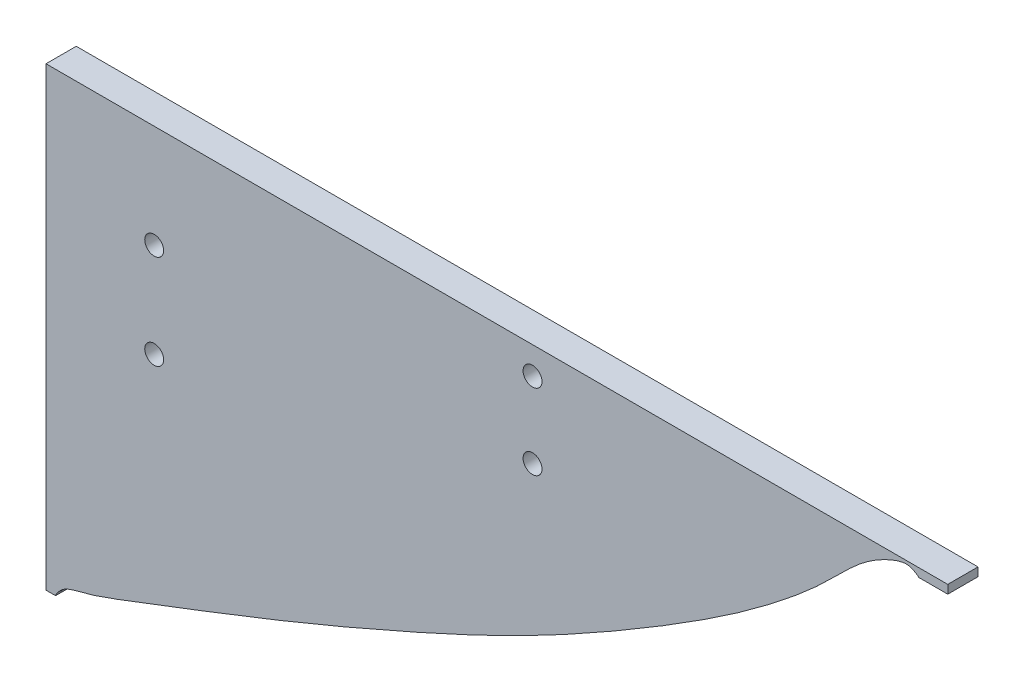
ISO-10303-21;
HEADER;
FILE_DESCRIPTION(('STEP AP214'),'2;1');
FILE_NAME('part.step','',(''),(''),'','','');
FILE_SCHEMA(('AUTOMOTIVE_DESIGN { 1 0 10303 214 1 1 1 1 }'));
ENDSEC;
DATA;
#1=APPLICATION_CONTEXT('core data for automotive mechanical design processes');
#2=APPLICATION_PROTOCOL_DEFINITION('international standard','automotive_design',2000,#1);
#3=PRODUCT_CONTEXT('',#1,'mechanical');
#4=PRODUCT('Part','Part','',(#3));
#5=PRODUCT_RELATED_PRODUCT_CATEGORY('part','',(#4));
#6=PRODUCT_DEFINITION_FORMATION('','',#4);
#7=PRODUCT_DEFINITION_CONTEXT('part definition',#1,'design');
#8=PRODUCT_DEFINITION('design','',#6,#7);
#9=PRODUCT_DEFINITION_SHAPE('','',#8);
#10=(LENGTH_UNIT() NAMED_UNIT(*) SI_UNIT(.MILLI.,.METRE.));
#11=(NAMED_UNIT(*) PLANE_ANGLE_UNIT() SI_UNIT($,.RADIAN.));
#12=(NAMED_UNIT(*) SI_UNIT($,.STERADIAN.) SOLID_ANGLE_UNIT());
#13=UNCERTAINTY_MEASURE_WITH_UNIT(LENGTH_MEASURE(1.E-05),#10,'distance_accuracy_value','');
#14=(GEOMETRIC_REPRESENTATION_CONTEXT(3) GLOBAL_UNCERTAINTY_ASSIGNED_CONTEXT((#13)) GLOBAL_UNIT_ASSIGNED_CONTEXT((#10,
#11,#12)) REPRESENTATION_CONTEXT('',''));
#15=CARTESIAN_POINT('',(0.,0.,0.));
#16=DIRECTION('',(0.,0.,1.));
#17=DIRECTION('',(1.,0.,0.));
#18=AXIS2_PLACEMENT_3D('',#15,#16,#17);
#19=CARTESIAN_POINT('',(-6.38847800720886,-67.6544227135779,132.));
#20=DIRECTION('',(0.,0.,-1.));
#21=DIRECTION('',(-1.,0.,0.));
#22=AXIS2_PLACEMENT_3D('',#19,#20,#21);
#23=PLANE('',#22);
#24=CARTESIAN_POINT('',(-100.,-50.,132.));
#25=DIRECTION('',(0.,0.,-1.));
#26=DIRECTION('',(-1.,0.,0.));
#27=AXIS2_PLACEMENT_3D('',#24,#25,#26);
#28=CIRCLE('',#27,2.5);
#29=CARTESIAN_POINT('',(-102.5,-50.,132.));
#30=VERTEX_POINT('',#29);
#31=EDGE_CURVE('E182',#30,#30,#28,.F.);
#32=ORIENTED_EDGE('',*,*,#31,.F.);
#33=EDGE_LOOP('',(#32));
#34=FACE_BOUND('',#33,.T.);
#35=CARTESIAN_POINT('',(0.0705666698621599,-4.96037406111782,132.));
#36=DIRECTION('',(0.,0.,-1.));
#37=DIRECTION('',(-1.,0.,0.));
#38=AXIS2_PLACEMENT_3D('',#35,#36,#37);
#39=CIRCLE('',#38,2.5);
#40=CARTESIAN_POINT('',(-2.42943333013784,-4.96037406111782,132.));
#41=VERTEX_POINT('',#40);
#42=EDGE_CURVE('E178',#41,#41,#39,.F.);
#43=ORIENTED_EDGE('',*,*,#42,.F.);
#44=EDGE_LOOP('',(#43));
#45=FACE_BOUND('',#44,.T.);
#46=CARTESIAN_POINT('',(102.255883432908,0.,132.));
#47=CARTESIAN_POINT('',(102.212333702175,0.0757853467575065,132.));
#48=CARTESIAN_POINT('',(102.15674500759,0.143644147111157,132.));
#49=CARTESIAN_POINT('',(102.031689039428,0.261850328451282,132.));
#50=CARTESIAN_POINT('',(101.961396337404,0.313864031923214,132.));
#51=CARTESIAN_POINT('',(101.743153899466,0.456916701566914,132.));
#52=CARTESIAN_POINT('',(101.590113741541,0.538561158667253,132.));
#53=CARTESIAN_POINT('',(101.285515903748,0.704546557379673,132.));
#54=CARTESIAN_POINT('',(101.135038893224,0.790853132229553,132.));
#55=CARTESIAN_POINT('',(100.830369958525,0.956709212530448,132.));
#56=CARTESIAN_POINT('',(100.675386799418,1.03511937173944,132.));
#57=CARTESIAN_POINT('',(100.358269386812,1.17769336420937,132.));
#58=CARTESIAN_POINT('',(100.197786977393,1.24188972080921,132.));
#59=CARTESIAN_POINT('',(99.8694857009078,1.34324074708624,132.));
#60=CARTESIAN_POINT('',(99.7013817997487,1.37934480036868,132.));
#61=CARTESIAN_POINT('',(99.358171575679,1.42574245374584,132.));
#62=CARTESIAN_POINT('',(99.1828585913646,1.43584947354909,132.));
#63=CARTESIAN_POINT('',(98.8372618622271,1.43510779384474,132.));
#64=CARTESIAN_POINT('',(98.6654304424398,1.42454375565803,132.));
#65=CARTESIAN_POINT('',(98.1519730994347,1.37137917150377,132.));
#66=CARTESIAN_POINT('',(97.8113579053392,1.30759815360346,132.));
#67=CARTESIAN_POINT('',(97.137425552706,1.15053661480719,132.));
#68=CARTESIAN_POINT('',(96.8059108548438,1.05870475531274,132.));
#69=CARTESIAN_POINT('',(95.8256317795282,0.748403885964516,132.));
#70=CARTESIAN_POINT('',(95.1909751337491,0.495513349615646,132.));
#71=CARTESIAN_POINT('',(93.9391842818814,-0.0530208130887405,132.));
#72=CARTESIAN_POINT('',(93.322654058673,-0.350138100355449,132.));
#73=CARTESIAN_POINT('',(92.1063389223837,-0.985229642510167,132.));
#74=CARTESIAN_POINT('',(91.5062710275768,-1.322691455428,132.));
#75=CARTESIAN_POINT('',(89.7488909647868,-2.3779604982981,132.));
#76=CARTESIAN_POINT('',(88.6284065608409,-3.14434191539668,132.));
#77=CARTESIAN_POINT('',(85.4169513530649,-5.62802153888396,132.));
#78=CARTESIAN_POINT('',(83.4639636842948,-7.51507379862691,132.));
#79=CARTESIAN_POINT('',(80.56562165714,-10.3839615966199,132.));
#80=CARTESIAN_POINT('',(79.6035536826595,-11.3452023134844,132.));
#81=CARTESIAN_POINT('',(77.6597820281172,-13.2439593645554,132.));
#82=CARTESIAN_POINT('',(76.6801903849135,-14.184049900242,132.));
#83=CARTESIAN_POINT('',(73.6999171590888,-16.9543026958801,132.));
#84=CARTESIAN_POINT('',(71.6553559072728,-18.7315758230486,132.));
#85=CARTESIAN_POINT('',(67.4892024660388,-22.1932749898395,132.));
#86=CARTESIAN_POINT('',(65.3681058831868,-23.8782983949837,132.));
#87=CARTESIAN_POINT('',(61.0697266750759,-27.1806229295135,132.));
#88=CARTESIAN_POINT('',(58.8915498559034,-28.7968462672591,132.));
#89=CARTESIAN_POINT('',(54.4766885782321,-31.958772395036,132.));
#90=CARTESIAN_POINT('',(52.2416055237548,-33.5047717594547,132.));
#91=CARTESIAN_POINT('',(47.7353420637075,-36.5373977922789,132.));
#92=CARTESIAN_POINT('',(45.463038676995,-38.0249032903029,132.));
#93=CARTESIAN_POINT('',(40.8907764149641,-40.9583588793518,132.));
#94=CARTESIAN_POINT('',(38.5907599263271,-42.4039744011,132.));
#95=CARTESIAN_POINT('',(31.6580128905092,-46.6856179228925,132.));
#96=CARTESIAN_POINT('',(26.9910343335263,-49.4682573561053,132.));
#97=CARTESIAN_POINT('',(17.5902574479986,-54.9118801825134,132.));
#98=CARTESIAN_POINT('',(12.8569467746059,-57.574117527531,132.));
#99=CARTESIAN_POINT('',(3.30274987506676,-62.7401208184053,132.));
#100=CARTESIAN_POINT('',(-1.52177689715146,-65.2415295397191,132.));
#101=CARTESIAN_POINT('',(-11.2551791172657,-70.0673158874365,132.));
#102=CARTESIAN_POINT('',(-16.1632048722033,-72.3926017729868,132.));
#103=CARTESIAN_POINT('',(-26.0307111592787,-76.9340906103058,132.));
#104=CARTESIAN_POINT('',(-30.9890076087882,-79.1538904388587,132.));
#105=CARTESIAN_POINT('',(-40.9329295585576,-83.5296133258051,132.));
#106=CARTESIAN_POINT('',(-45.9192017976006,-85.6839581754804,132.));
#107=CARTESIAN_POINT('',(-55.9255439205812,-89.9134947041028,132.));
#108=CARTESIAN_POINT('',(-60.9469816390454,-91.986269531141,132.));
#109=CARTESIAN_POINT('',(-71.0223384536489,-96.051671342611,132.));
#110=CARTESIAN_POINT('',(-76.0755891927826,-98.0455548806497,132.));
#111=CARTESIAN_POINT('',(-86.1992002748512,-101.989606761236,132.));
#112=CARTESIAN_POINT('',(-91.2682568154779,-103.943004483879,132.));
#113=CARTESIAN_POINT('',(-98.8744156847139,-106.866307941879,132.));
#114=CARTESIAN_POINT('',(-101.410515949715,-107.838908010764,132.));
#115=CARTESIAN_POINT('',(-105.218733324845,-109.287094100231,132.));
#116=CARTESIAN_POINT('',(-106.48883459863,-109.767990845195,132.));
#117=CARTESIAN_POINT('',(-109.030247373088,-110.726596507474,132.));
#118=CARTESIAN_POINT('',(-110.300344760388,-111.207758330822,132.));
#119=CARTESIAN_POINT('',(-112.848589151878,-112.146786916231,132.));
#120=CARTESIAN_POINT('',(-114.128228981547,-112.600390896174,132.));
#121=CARTESIAN_POINT('',(-116.068272569947,-113.221442548852,132.));
#122=CARTESIAN_POINT('',(-116.718235773445,-113.418995970083,132.));
#123=CARTESIAN_POINT('',(-118.025292416655,-113.793542498143,132.));
#124=CARTESIAN_POINT('',(-118.683529132218,-113.967238924432,132.));
#125=CARTESIAN_POINT('',(-120.003170626691,-114.305496542706,132.));
#126=CARTESIAN_POINT('',(-120.66294522224,-114.474758432035,132.));
#127=CARTESIAN_POINT('',(-121.637815162637,-114.7713044396,132.));
#128=CARTESIAN_POINT('',(-121.96038877965,-114.877024668183,132.));
#129=CARTESIAN_POINT('',(-122.597951577422,-115.110335143294,132.));
#130=CARTESIAN_POINT('',(-122.91286533254,-115.238142882605,132.));
#131=CARTESIAN_POINT('',(-123.528369067504,-115.535061526255,132.));
#132=CARTESIAN_POINT('',(-123.829073278428,-115.703843040825,132.));
#133=CARTESIAN_POINT('',(-124.262208128201,-116.008692561106,132.));
#134=CARTESIAN_POINT('',(-124.402660661187,-116.118633489897,132.));
#135=CARTESIAN_POINT('',(-124.665987731146,-116.35108408229,132.));
#136=CARTESIAN_POINT('',(-124.790202020289,-116.474200061881,132.));
#137=CARTESIAN_POINT('',(-125.02903540407,-116.729307744712,132.));
#138=CARTESIAN_POINT('',(-125.143548931705,-116.861397099286,132.));
#139=CARTESIAN_POINT('',(-125.363141762099,-117.134302632346,132.));
#140=CARTESIAN_POINT('',(-125.468326770699,-117.275021031071,132.));
#141=CARTESIAN_POINT('',(-125.678571382075,-117.556573831112,132.));
#142=CARTESIAN_POINT('',(-125.783024733824,-117.698431608379,132.));
#143=CARTESIAN_POINT('',(-125.967660285681,-117.997314761751,132.));
#144=CARTESIAN_POINT('',(-126.04813316829,-118.156020317345,132.));
#145=CARTESIAN_POINT('',(-126.078302390809,-118.330668804013,132.));
#146=B_SPLINE_CURVE_WITH_KNOTS('',3,(#46,#47,#48,#49,#50,#51,#52,#53,#54,#55,#56,#57,#58,#59,
#60,#61,#62,#63,#64,#65,#66,#67,#68,#69,#70,#71,#72,#73,#74,#75,#76,#77,#78,#79,#80,#81,#82,#83,
#84,#85,#86,#87,#88,#89,#90,#91,#92,#93,#94,#95,#96,#97,#98,#99,#100,#101,#102,#103,#104,#105,
#106,#107,#108,#109,#110,#111,#112,#113,#114,#115,#116,#117,#118,#119,#120,#121,#122,#123,#124,
#125,#126,#127,#128,#129,#130,#131,#132,#133,#134,#135,#136,#137,#138,#139,#140,#141,#142,#143,
#144,#145),.UNSPECIFIED.,.F.,.F.,(4,2,2,2,2,2,2,2,2,2,2,2,2,2,2,2,2,2,2,2,2,2,2,2,2,2,2,2,2,2,2,
2,2,2,2,2,2,2,2,2,2,2,2,2,2,2,2,2,2,4),(0.,0.0009765625,0.00195312499999989,0.00390624999999989,
0.00585937499999978,0.00781249999999978,0.00976562499999967,0.0117187499999997,
0.0136718749999996,0.0156249999999996,0.0195312499999993,0.0234374999999992,0.0312499999999992,
0.0390624999999991,0.046874999999999,0.0624999999999988,0.0937499999999986,0.109374999999998,
0.124999999999998,0.156249999999998,0.187499999999998,0.218749999999998,0.249999999999998,
0.281249999999998,0.312499999999998,0.374999999999998,0.437499999999999,0.499999999999999,
0.562499999999999,0.624999999999999,0.687499999999999,0.749999999999999,0.812499999999999,0.875,
0.90625,0.921875,0.9375,0.953125,0.9609375,0.96875,0.9765625,0.98046875,0.984375,0.98828125,
0.990234375,0.9921875,0.994140625,0.99609375,0.998046875,1.),.UNSPECIFIED.);
#147=CARTESIAN_POINT('',(-126.078302390805,-118.330668804014,132.));
#148=VERTEX_POINT('',#147);
#149=CARTESIAN_POINT('',(102.255883432908,0.,132.));
#150=VERTEX_POINT('',#149);
#151=EDGE_CURVE('E130',#148,#150,#146,.F.);
#152=ORIENTED_EDGE('',*,*,#151,.T.);
#153=DIRECTION('',(1.,0.,0.));
#154=VECTOR('',#153,1.);
#155=CARTESIAN_POINT('',(102.255883432908,0.,132.));
#156=LINE('',#155,#154);
#157=CARTESIAN_POINT('',(109.897979825802,0.,132.));
#158=VERTEX_POINT('',#157);
#159=EDGE_CURVE('E88',#150,#158,#156,.T.);
#160=ORIENTED_EDGE('',*,*,#159,.T.);
#161=DIRECTION('',(0.,1.,0.));
#162=VECTOR('',#161,1.);
#163=CARTESIAN_POINT('',(109.897979825802,2.25600000000004,132.));
#164=LINE('',#163,#162);
#165=CARTESIAN_POINT('',(109.897979825802,2.25600000000004,132.));
#166=VERTEX_POINT('',#165);
#167=EDGE_CURVE('E101',#158,#166,#164,.T.);
#168=ORIENTED_EDGE('',*,*,#167,.T.);
#169=DIRECTION('',(-1.,0.,0.));
#170=VECTOR('',#169,1.);
#171=CARTESIAN_POINT('',(109.897979825802,2.25600000000004,132.));
#172=LINE('',#171,#170);
#173=CARTESIAN_POINT('',(-128.613604220429,2.25600000000001,132.));
#174=VERTEX_POINT('',#173);
#175=EDGE_CURVE('E95',#166,#174,#172,.T.);
#176=ORIENTED_EDGE('',*,*,#175,.T.);
#177=DIRECTION('',(0.,-1.,0.));
#178=VECTOR('',#177,1.);
#179=CARTESIAN_POINT('',(-128.613604220429,-118.330763244015,132.));
#180=LINE('',#179,#178);
#181=CARTESIAN_POINT('',(-128.613604220429,-118.330763244015,132.));
#182=VERTEX_POINT('',#181);
#183=EDGE_CURVE('E99',#174,#182,#180,.T.);
#184=ORIENTED_EDGE('',*,*,#183,.T.);
#185=DIRECTION('',(0.999999999306219,3.72500027844127E-05,0.));
#186=VECTOR('',#185,1.);
#187=CARTESIAN_POINT('',(-128.613604220429,-118.330763244015,132.));
#188=LINE('',#187,#186);
#189=EDGE_CURVE('E51',#182,#148,#188,.T.);
#190=ORIENTED_EDGE('',*,*,#189,.T.);
#191=EDGE_LOOP('',(#152,#160,#168,#176,#184,#190));
#192=FACE_BOUND('',#191,.T.);
#193=CARTESIAN_POINT('',(0.0705666698621599,-25.,132.));
#194=DIRECTION('',(0.,0.,-1.));
#195=DIRECTION('',(-1.,0.,0.));
#196=AXIS2_PLACEMENT_3D('',#193,#194,#195);
#197=CIRCLE('',#196,2.5);
#198=CARTESIAN_POINT('',(-2.42943333013784,-25.,132.));
#199=VERTEX_POINT('',#198);
#200=EDGE_CURVE('E179',#199,#199,#197,.F.);
#201=ORIENTED_EDGE('',*,*,#200,.F.);
#202=EDGE_LOOP('',(#201));
#203=FACE_BOUND('',#202,.T.);
#204=CARTESIAN_POINT('',(-100.,-25.,132.));
#205=DIRECTION('',(0.,0.,-1.));
#206=DIRECTION('',(-1.,0.,0.));
#207=AXIS2_PLACEMENT_3D('',#204,#205,#206);
#208=CIRCLE('',#207,2.5);
#209=CARTESIAN_POINT('',(-102.5,-25.,132.));
#210=VERTEX_POINT('',#209);
#211=EDGE_CURVE('E185',#210,#210,#208,.F.);
#212=ORIENTED_EDGE('',*,*,#211,.F.);
#213=EDGE_LOOP('',(#212));
#214=FACE_BOUND('',#213,.T.);
#215=ADVANCED_FACE('F30',(#34,#45,#192,#203,#214),#23,.F.);
#216=CARTESIAN_POINT('',(-6.38847800720886,-67.6544227135779,124.));
#217=DIRECTION('',(0.,0.,-1.));
#218=DIRECTION('',(-1.,0.,0.));
#219=AXIS2_PLACEMENT_3D('',#216,#217,#218);
#220=PLANE('',#219);
#221=CARTESIAN_POINT('',(-100.,-50.,124.));
#222=DIRECTION('',(0.,0.,-1.));
#223=DIRECTION('',(-1.,0.,0.));
#224=AXIS2_PLACEMENT_3D('',#221,#222,#223);
#225=CIRCLE('',#224,2.5);
#226=CARTESIAN_POINT('',(-102.5,-50.,124.));
#227=VERTEX_POINT('',#226);
#228=EDGE_CURVE('E183',#227,#227,#225,.F.);
#229=ORIENTED_EDGE('',*,*,#228,.T.);
#230=EDGE_LOOP('',(#229));
#231=FACE_BOUND('',#230,.T.);
#232=CARTESIAN_POINT('',(0.0705666698621599,-4.96037406111782,124.));
#233=DIRECTION('',(0.,0.,-1.));
#234=DIRECTION('',(-1.,0.,0.));
#235=AXIS2_PLACEMENT_3D('',#232,#233,#234);
#236=CIRCLE('',#235,2.5);
#237=CARTESIAN_POINT('',(-2.42943333013784,-4.96037406111782,124.));
#238=VERTEX_POINT('',#237);
#239=EDGE_CURVE('E175',#238,#238,#236,.F.);
#240=ORIENTED_EDGE('',*,*,#239,.T.);
#241=EDGE_LOOP('',(#240));
#242=FACE_BOUND('',#241,.T.);
#243=CARTESIAN_POINT('',(-126.078302390809,-118.330668804013,124.));
#244=CARTESIAN_POINT('',(-126.04813316829,-118.156020317345,124.));
#245=CARTESIAN_POINT('',(-125.967660285681,-117.997314761751,124.));
#246=CARTESIAN_POINT('',(-125.783024733824,-117.698431608379,124.));
#247=CARTESIAN_POINT('',(-125.678571382075,-117.556573831112,124.));
#248=CARTESIAN_POINT('',(-125.468326770699,-117.275021031071,124.));
#249=CARTESIAN_POINT('',(-125.363141762099,-117.134302632346,124.));
#250=CARTESIAN_POINT('',(-125.143548931705,-116.861397099286,124.));
#251=CARTESIAN_POINT('',(-125.02903540407,-116.729307744712,124.));
#252=CARTESIAN_POINT('',(-124.790202020289,-116.474200061881,124.));
#253=CARTESIAN_POINT('',(-124.665987731146,-116.35108408229,124.));
#254=CARTESIAN_POINT('',(-124.402660661187,-116.118633489897,124.));
#255=CARTESIAN_POINT('',(-124.262208128201,-116.008692561106,124.));
#256=CARTESIAN_POINT('',(-123.829073278428,-115.703843040825,124.));
#257=CARTESIAN_POINT('',(-123.528369067504,-115.535061526255,124.));
#258=CARTESIAN_POINT('',(-122.91286533254,-115.238142882605,124.));
#259=CARTESIAN_POINT('',(-122.597951577422,-115.110335143294,124.));
#260=CARTESIAN_POINT('',(-121.96038877965,-114.877024668183,124.));
#261=CARTESIAN_POINT('',(-121.637815162637,-114.7713044396,124.));
#262=CARTESIAN_POINT('',(-120.66294522224,-114.474758432035,124.));
#263=CARTESIAN_POINT('',(-120.003170626691,-114.305496542706,124.));
#264=CARTESIAN_POINT('',(-118.683529132218,-113.967238924432,124.));
#265=CARTESIAN_POINT('',(-118.025292416655,-113.793542498143,124.));
#266=CARTESIAN_POINT('',(-116.718235773445,-113.418995970083,124.));
#267=CARTESIAN_POINT('',(-116.068272569947,-113.221442548852,124.));
#268=CARTESIAN_POINT('',(-114.128228981547,-112.600390896174,124.));
#269=CARTESIAN_POINT('',(-112.848589151878,-112.146786916231,124.));
#270=CARTESIAN_POINT('',(-110.300344760388,-111.207758330822,124.));
#271=CARTESIAN_POINT('',(-109.030247373088,-110.726596507474,124.));
#272=CARTESIAN_POINT('',(-106.48883459863,-109.767990845195,124.));
#273=CARTESIAN_POINT('',(-105.218733324845,-109.287094100231,124.));
#274=CARTESIAN_POINT('',(-101.410515949715,-107.838908010764,124.));
#275=CARTESIAN_POINT('',(-98.8744156847139,-106.866307941879,124.));
#276=CARTESIAN_POINT('',(-91.2682568154779,-103.943004483879,124.));
#277=CARTESIAN_POINT('',(-86.1992002748512,-101.989606761236,124.));
#278=CARTESIAN_POINT('',(-76.0755891927826,-98.0455548806497,124.));
#279=CARTESIAN_POINT('',(-71.0223384536489,-96.051671342611,124.));
#280=CARTESIAN_POINT('',(-60.9469816390454,-91.986269531141,124.));
#281=CARTESIAN_POINT('',(-55.9255439205812,-89.9134947041028,124.));
#282=CARTESIAN_POINT('',(-45.9192017976006,-85.6839581754804,124.));
#283=CARTESIAN_POINT('',(-40.9329295585576,-83.5296133258051,124.));
#284=CARTESIAN_POINT('',(-30.9890076087882,-79.1538904388587,124.));
#285=CARTESIAN_POINT('',(-26.0307111592787,-76.9340906103058,124.));
#286=CARTESIAN_POINT('',(-16.1632048722033,-72.3926017729868,124.));
#287=CARTESIAN_POINT('',(-11.2551791172657,-70.0673158874365,124.));
#288=CARTESIAN_POINT('',(-1.52177689715146,-65.2415295397191,124.));
#289=CARTESIAN_POINT('',(3.30274987506676,-62.7401208184053,124.));
#290=CARTESIAN_POINT('',(12.8569467746059,-57.574117527531,124.));
#291=CARTESIAN_POINT('',(17.5902574479986,-54.9118801825134,124.));
#292=CARTESIAN_POINT('',(26.9910343335263,-49.4682573561053,124.));
#293=CARTESIAN_POINT('',(31.6580128905092,-46.6856179228925,124.));
#294=CARTESIAN_POINT('',(38.5907599263271,-42.4039744011,124.));
#295=CARTESIAN_POINT('',(40.8907764149641,-40.9583588793518,124.));
#296=CARTESIAN_POINT('',(45.463038676995,-38.0249032903029,124.));
#297=CARTESIAN_POINT('',(47.7353420637075,-36.5373977922789,124.));
#298=CARTESIAN_POINT('',(52.2416055237548,-33.5047717594547,124.));
#299=CARTESIAN_POINT('',(54.4766885782321,-31.958772395036,124.));
#300=CARTESIAN_POINT('',(58.8915498559034,-28.7968462672591,124.));
#301=CARTESIAN_POINT('',(61.0697266750759,-27.1806229295135,124.));
#302=CARTESIAN_POINT('',(65.3681058831868,-23.8782983949837,124.));
#303=CARTESIAN_POINT('',(67.4892024660388,-22.1932749898395,124.));
#304=CARTESIAN_POINT('',(71.6553559072728,-18.7315758230486,124.));
#305=CARTESIAN_POINT('',(73.6999171590888,-16.9543026958801,124.));
#306=CARTESIAN_POINT('',(76.6801903849135,-14.184049900242,124.));
#307=CARTESIAN_POINT('',(77.6597820281172,-13.2439593645554,124.));
#308=CARTESIAN_POINT('',(79.6035536826595,-11.3452023134844,124.));
#309=CARTESIAN_POINT('',(80.56562165714,-10.3839615966199,124.));
#310=CARTESIAN_POINT('',(83.4639636842948,-7.51507379862691,124.));
#311=CARTESIAN_POINT('',(85.4169513530649,-5.62802153888396,124.));
#312=CARTESIAN_POINT('',(88.6284065608409,-3.14434191539668,124.));
#313=CARTESIAN_POINT('',(89.7488909647868,-2.3779604982981,124.));
#314=CARTESIAN_POINT('',(91.5062710275768,-1.322691455428,124.));
#315=CARTESIAN_POINT('',(92.1063389223837,-0.985229642510167,124.));
#316=CARTESIAN_POINT('',(93.322654058673,-0.350138100355449,124.));
#317=CARTESIAN_POINT('',(93.9391842818814,-0.0530208130887405,124.));
#318=CARTESIAN_POINT('',(95.1909751337491,0.495513349615646,124.));
#319=CARTESIAN_POINT('',(95.8256317795282,0.748403885964516,124.));
#320=CARTESIAN_POINT('',(96.8059108548438,1.05870475531274,124.));
#321=CARTESIAN_POINT('',(97.137425552706,1.15053661480719,124.));
#322=CARTESIAN_POINT('',(97.8113579053392,1.30759815360346,124.));
#323=CARTESIAN_POINT('',(98.1519730994347,1.37137917150377,124.));
#324=CARTESIAN_POINT('',(98.6654304424398,1.42454375565803,124.));
#325=CARTESIAN_POINT('',(98.8372618622271,1.43510779384474,124.));
#326=CARTESIAN_POINT('',(99.1828585913646,1.43584947354909,124.));
#327=CARTESIAN_POINT('',(99.358171575679,1.42574245374584,124.));
#328=CARTESIAN_POINT('',(99.7013817997487,1.37934480036868,124.));
#329=CARTESIAN_POINT('',(99.8694857009078,1.34324074708624,124.));
#330=CARTESIAN_POINT('',(100.197786977393,1.24188972080921,124.));
#331=CARTESIAN_POINT('',(100.358269386812,1.17769336420937,124.));
#332=CARTESIAN_POINT('',(100.675386799418,1.03511937173944,124.));
#333=CARTESIAN_POINT('',(100.830369958525,0.956709212530448,124.));
#334=CARTESIAN_POINT('',(101.135038893224,0.790853132229553,124.));
#335=CARTESIAN_POINT('',(101.285515903748,0.704546557379673,124.));
#336=CARTESIAN_POINT('',(101.590113741541,0.538561158667253,124.));
#337=CARTESIAN_POINT('',(101.743153899466,0.456916701566914,124.));
#338=CARTESIAN_POINT('',(101.961396337404,0.313864031923214,124.));
#339=CARTESIAN_POINT('',(102.031689039428,0.261850328451282,124.));
#340=CARTESIAN_POINT('',(102.15674500759,0.143644147111157,124.));
#341=CARTESIAN_POINT('',(102.212333702175,0.0757853467575065,124.));
#342=CARTESIAN_POINT('',(102.255883432908,0.,124.));
#343=B_SPLINE_CURVE_WITH_KNOTS('',3,(#243,#244,#245,#246,#247,#248,#249,#250,#251,#252,#253,
#254,#255,#256,#257,#258,#259,#260,#261,#262,#263,#264,#265,#266,#267,#268,#269,#270,#271,#272,
#273,#274,#275,#276,#277,#278,#279,#280,#281,#282,#283,#284,#285,#286,#287,#288,#289,#290,#291,
#292,#293,#294,#295,#296,#297,#298,#299,#300,#301,#302,#303,#304,#305,#306,#307,#308,#309,#310,
#311,#312,#313,#314,#315,#316,#317,#318,#319,#320,#321,#322,#323,#324,#325,#326,#327,#328,#329,
#330,#331,#332,#333,#334,#335,#336,#337,#338,#339,#340,#341,#342),.UNSPECIFIED.,.F.,.F.,(4,2,2,
2,2,2,2,2,2,2,2,2,2,2,2,2,2,2,2,2,2,2,2,2,2,2,2,2,2,2,2,2,2,2,2,2,2,2,2,2,2,2,2,2,2,2,2,2,2,4),
(0.,0.00195312500000011,0.00390625000000022,0.00585937500000022,0.00781250000000033,
0.00976562500000033,0.0117187500000004,0.0156250000000004,0.0195312500000003,0.0234375000000003,
0.0312500000000003,0.0390625000000003,0.0468750000000003,0.0625000000000003,0.0781250000000004,
0.0937500000000004,0.125,0.187500000000001,0.250000000000001,0.312500000000001,
0.375000000000001,0.437500000000001,0.500000000000001,0.562500000000001,0.625000000000002,
0.687500000000002,0.718750000000002,0.750000000000002,0.781250000000002,0.812500000000002,
0.843750000000002,0.875000000000002,0.890625000000002,0.906250000000001,0.937500000000001,
0.953125000000001,0.960937500000001,0.968750000000001,0.976562500000001,0.980468750000001,
0.984375,0.986328125,0.98828125,0.990234375,0.9921875,0.994140625,0.99609375,0.998046875,
0.9990234375,1.),.UNSPECIFIED.);
#344=CARTESIAN_POINT('',(-126.078302390805,-118.330668804014,124.));
#345=VERTEX_POINT('',#344);
#346=CARTESIAN_POINT('',(102.255883432908,0.,124.));
#347=VERTEX_POINT('',#346);
#348=EDGE_CURVE('E172',#345,#347,#343,.T.);
#349=ORIENTED_EDGE('',*,*,#348,.F.);
#350=DIRECTION('',(0.999999999306219,3.72500027844127E-05,0.));
#351=VECTOR('',#350,1.);
#352=CARTESIAN_POINT('',(-128.613604220429,-118.330763244015,124.));
#353=LINE('',#352,#351);
#354=CARTESIAN_POINT('',(-128.613604220429,-118.330763244015,124.));
#355=VERTEX_POINT('',#354);
#356=EDGE_CURVE('E80',#355,#345,#353,.T.);
#357=ORIENTED_EDGE('',*,*,#356,.F.);
#358=DIRECTION('',(0.,-1.,0.));
#359=VECTOR('',#358,1.);
#360=CARTESIAN_POINT('',(-128.613604220429,-118.330763244015,124.));
#361=LINE('',#360,#359);
#362=CARTESIAN_POINT('',(-128.613604220429,2.25600000000001,124.));
#363=VERTEX_POINT('',#362);
#364=EDGE_CURVE('E74',#363,#355,#361,.T.);
#365=ORIENTED_EDGE('',*,*,#364,.F.);
#366=DIRECTION('',(-1.,0.,0.));
#367=VECTOR('',#366,1.);
#368=CARTESIAN_POINT('',(109.897979825802,2.25600000000004,124.));
#369=LINE('',#368,#367);
#370=CARTESIAN_POINT('',(109.897979825802,2.25600000000004,124.));
#371=VERTEX_POINT('',#370);
#372=EDGE_CURVE('E109',#371,#363,#369,.T.);
#373=ORIENTED_EDGE('',*,*,#372,.F.);
#374=DIRECTION('',(0.,1.,0.));
#375=VECTOR('',#374,1.);
#376=CARTESIAN_POINT('',(109.897979825802,2.25600000000004,124.));
#377=LINE('',#376,#375);
#378=CARTESIAN_POINT('',(109.897979825802,0.,124.));
#379=VERTEX_POINT('',#378);
#380=EDGE_CURVE('E119',#379,#371,#377,.T.);
#381=ORIENTED_EDGE('',*,*,#380,.F.);
#382=DIRECTION('',(1.,0.,0.));
#383=VECTOR('',#382,1.);
#384=CARTESIAN_POINT('',(102.255883432908,0.,124.));
#385=LINE('',#384,#383);
#386=EDGE_CURVE('E121',#347,#379,#385,.T.);
#387=ORIENTED_EDGE('',*,*,#386,.F.);
#388=EDGE_LOOP('',(#349,#357,#365,#373,#381,#387));
#389=FACE_BOUND('',#388,.T.);
#390=CARTESIAN_POINT('',(0.0705666698621599,-25.,124.));
#391=DIRECTION('',(0.,0.,-1.));
#392=DIRECTION('',(-1.,0.,0.));
#393=AXIS2_PLACEMENT_3D('',#390,#391,#392);
#394=CIRCLE('',#393,2.5);
#395=CARTESIAN_POINT('',(-2.42943333013784,-25.,124.));
#396=VERTEX_POINT('',#395);
#397=EDGE_CURVE('E180',#396,#396,#394,.F.);
#398=ORIENTED_EDGE('',*,*,#397,.T.);
#399=EDGE_LOOP('',(#398));
#400=FACE_BOUND('',#399,.T.);
#401=CARTESIAN_POINT('',(-100.,-25.,124.));
#402=DIRECTION('',(0.,0.,-1.));
#403=DIRECTION('',(-1.,0.,0.));
#404=AXIS2_PLACEMENT_3D('',#401,#402,#403);
#405=CIRCLE('',#404,2.5);
#406=CARTESIAN_POINT('',(-102.5,-25.,124.));
#407=VERTEX_POINT('',#406);
#408=EDGE_CURVE('E36',#407,#407,#405,.F.);
#409=ORIENTED_EDGE('',*,*,#408,.T.);
#410=EDGE_LOOP('',(#409));
#411=FACE_BOUND('',#410,.T.);
#412=ADVANCED_FACE('F146',(#231,#242,#389,#400,#411),#220,.T.);
#413=CARTESIAN_POINT('',(-126.078302390809,-118.330668804013,132.));
#414=CARTESIAN_POINT('',(-126.04813316829,-118.156020317345,132.));
#415=CARTESIAN_POINT('',(-125.967660285681,-117.997314761751,132.));
#416=CARTESIAN_POINT('',(-125.783024733824,-117.698431608379,132.));
#417=CARTESIAN_POINT('',(-125.678571382075,-117.556573831112,132.));
#418=CARTESIAN_POINT('',(-125.468326770699,-117.275021031071,132.));
#419=CARTESIAN_POINT('',(-125.363141762099,-117.134302632346,132.));
#420=CARTESIAN_POINT('',(-125.143548931705,-116.861397099286,132.));
#421=CARTESIAN_POINT('',(-125.02903540407,-116.729307744712,132.));
#422=CARTESIAN_POINT('',(-124.790202020289,-116.474200061881,132.));
#423=CARTESIAN_POINT('',(-124.665987731146,-116.35108408229,132.));
#424=CARTESIAN_POINT('',(-124.402660661187,-116.118633489897,132.));
#425=CARTESIAN_POINT('',(-124.262208128201,-116.008692561106,132.));
#426=CARTESIAN_POINT('',(-123.829073278428,-115.703843040825,132.));
#427=CARTESIAN_POINT('',(-123.528369067504,-115.535061526255,132.));
#428=CARTESIAN_POINT('',(-122.91286533254,-115.238142882605,132.));
#429=CARTESIAN_POINT('',(-122.597951577422,-115.110335143294,132.));
#430=CARTESIAN_POINT('',(-121.96038877965,-114.877024668183,132.));
#431=CARTESIAN_POINT('',(-121.637815162637,-114.7713044396,132.));
#432=CARTESIAN_POINT('',(-120.66294522224,-114.474758432035,132.));
#433=CARTESIAN_POINT('',(-120.003170626691,-114.305496542706,132.));
#434=CARTESIAN_POINT('',(-118.683529132218,-113.967238924432,132.));
#435=CARTESIAN_POINT('',(-118.025292416655,-113.793542498143,132.));
#436=CARTESIAN_POINT('',(-116.718235773445,-113.418995970083,132.));
#437=CARTESIAN_POINT('',(-116.068272569947,-113.221442548852,132.));
#438=CARTESIAN_POINT('',(-114.128228981547,-112.600390896174,132.));
#439=CARTESIAN_POINT('',(-112.848589151878,-112.146786916231,132.));
#440=CARTESIAN_POINT('',(-110.300344760388,-111.207758330822,132.));
#441=CARTESIAN_POINT('',(-109.030247373088,-110.726596507474,132.));
#442=CARTESIAN_POINT('',(-106.48883459863,-109.767990845195,132.));
#443=CARTESIAN_POINT('',(-105.218733324845,-109.287094100231,132.));
#444=CARTESIAN_POINT('',(-101.410515949715,-107.838908010764,132.));
#445=CARTESIAN_POINT('',(-98.8744156847139,-106.866307941879,132.));
#446=CARTESIAN_POINT('',(-91.2682568154779,-103.943004483879,132.));
#447=CARTESIAN_POINT('',(-86.1992002748512,-101.989606761236,132.));
#448=CARTESIAN_POINT('',(-76.0755891927826,-98.0455548806497,132.));
#449=CARTESIAN_POINT('',(-71.0223384536489,-96.051671342611,132.));
#450=CARTESIAN_POINT('',(-60.9469816390454,-91.986269531141,132.));
#451=CARTESIAN_POINT('',(-55.9255439205812,-89.9134947041028,132.));
#452=CARTESIAN_POINT('',(-45.9192017976006,-85.6839581754804,132.));
#453=CARTESIAN_POINT('',(-40.9329295585576,-83.5296133258051,132.));
#454=CARTESIAN_POINT('',(-30.9890076087882,-79.1538904388587,132.));
#455=CARTESIAN_POINT('',(-26.0307111592787,-76.9340906103058,132.));
#456=CARTESIAN_POINT('',(-16.1632048722033,-72.3926017729868,132.));
#457=CARTESIAN_POINT('',(-11.2551791172657,-70.0673158874365,132.));
#458=CARTESIAN_POINT('',(-1.52177689715146,-65.2415295397191,132.));
#459=CARTESIAN_POINT('',(3.30274987506676,-62.7401208184053,132.));
#460=CARTESIAN_POINT('',(12.8569467746059,-57.574117527531,132.));
#461=CARTESIAN_POINT('',(17.5902574479986,-54.9118801825134,132.));
#462=CARTESIAN_POINT('',(26.9910343335263,-49.4682573561053,132.));
#463=CARTESIAN_POINT('',(31.6580128905092,-46.6856179228925,132.));
#464=CARTESIAN_POINT('',(38.5907599263271,-42.4039744011,132.));
#465=CARTESIAN_POINT('',(40.8907764149641,-40.9583588793518,132.));
#466=CARTESIAN_POINT('',(45.463038676995,-38.0249032903029,132.));
#467=CARTESIAN_POINT('',(47.7353420637075,-36.5373977922789,132.));
#468=CARTESIAN_POINT('',(52.2416055237548,-33.5047717594547,132.));
#469=CARTESIAN_POINT('',(54.4766885782321,-31.958772395036,132.));
#470=CARTESIAN_POINT('',(58.8915498559034,-28.7968462672591,132.));
#471=CARTESIAN_POINT('',(61.0697266750759,-27.1806229295135,132.));
#472=CARTESIAN_POINT('',(65.3681058831868,-23.8782983949837,132.));
#473=CARTESIAN_POINT('',(67.4892024660388,-22.1932749898395,132.));
#474=CARTESIAN_POINT('',(71.6553559072728,-18.7315758230486,132.));
#475=CARTESIAN_POINT('',(73.6999171590888,-16.9543026958801,132.));
#476=CARTESIAN_POINT('',(76.6801903849135,-14.184049900242,132.));
#477=CARTESIAN_POINT('',(77.6597820281172,-13.2439593645554,132.));
#478=CARTESIAN_POINT('',(79.6035536826595,-11.3452023134844,132.));
#479=CARTESIAN_POINT('',(80.56562165714,-10.3839615966199,132.));
#480=CARTESIAN_POINT('',(83.4639636842948,-7.51507379862691,132.));
#481=CARTESIAN_POINT('',(85.4169513530649,-5.62802153888396,132.));
#482=CARTESIAN_POINT('',(88.6284065608409,-3.14434191539668,132.));
#483=CARTESIAN_POINT('',(89.7488909647868,-2.3779604982981,132.));
#484=CARTESIAN_POINT('',(91.5062710275768,-1.322691455428,132.));
#485=CARTESIAN_POINT('',(92.1063389223837,-0.985229642510167,132.));
#486=CARTESIAN_POINT('',(93.322654058673,-0.350138100355449,132.));
#487=CARTESIAN_POINT('',(93.9391842818814,-0.0530208130887405,132.));
#488=CARTESIAN_POINT('',(95.1909751337491,0.495513349615646,132.));
#489=CARTESIAN_POINT('',(95.8256317795282,0.748403885964516,132.));
#490=CARTESIAN_POINT('',(96.8059108548438,1.05870475531274,132.));
#491=CARTESIAN_POINT('',(97.137425552706,1.15053661480719,132.));
#492=CARTESIAN_POINT('',(97.8113579053392,1.30759815360346,132.));
#493=CARTESIAN_POINT('',(98.1519730994347,1.37137917150377,132.));
#494=CARTESIAN_POINT('',(98.6654304424398,1.42454375565803,132.));
#495=CARTESIAN_POINT('',(98.8372618622271,1.43510779384474,132.));
#496=CARTESIAN_POINT('',(99.1828585913646,1.43584947354909,132.));
#497=CARTESIAN_POINT('',(99.358171575679,1.42574245374584,132.));
#498=CARTESIAN_POINT('',(99.7013817997487,1.37934480036868,132.));
#499=CARTESIAN_POINT('',(99.8694857009078,1.34324074708624,132.));
#500=CARTESIAN_POINT('',(100.197786977393,1.24188972080921,132.));
#501=CARTESIAN_POINT('',(100.358269386812,1.17769336420937,132.));
#502=CARTESIAN_POINT('',(100.675386799418,1.03511937173944,132.));
#503=CARTESIAN_POINT('',(100.830369958525,0.956709212530448,132.));
#504=CARTESIAN_POINT('',(101.135038893224,0.790853132229553,132.));
#505=CARTESIAN_POINT('',(101.285515903748,0.704546557379673,132.));
#506=CARTESIAN_POINT('',(101.590113741541,0.538561158667253,132.));
#507=CARTESIAN_POINT('',(101.743153899466,0.456916701566914,132.));
#508=CARTESIAN_POINT('',(101.961396337404,0.313864031923214,132.));
#509=CARTESIAN_POINT('',(102.031689039428,0.261850328451282,132.));
#510=CARTESIAN_POINT('',(102.15674500759,0.143644147111157,132.));
#511=CARTESIAN_POINT('',(102.212333702175,0.0757853467575065,132.));
#512=CARTESIAN_POINT('',(102.255883432908,0.,132.));
#513=B_SPLINE_CURVE_WITH_KNOTS('',3,(#413,#414,#415,#416,#417,#418,#419,#420,#421,#422,#423,
#424,#425,#426,#427,#428,#429,#430,#431,#432,#433,#434,#435,#436,#437,#438,#439,#440,#441,#442,
#443,#444,#445,#446,#447,#448,#449,#450,#451,#452,#453,#454,#455,#456,#457,#458,#459,#460,#461,
#462,#463,#464,#465,#466,#467,#468,#469,#470,#471,#472,#473,#474,#475,#476,#477,#478,#479,#480,
#481,#482,#483,#484,#485,#486,#487,#488,#489,#490,#491,#492,#493,#494,#495,#496,#497,#498,#499,
#500,#501,#502,#503,#504,#505,#506,#507,#508,#509,#510,#511,#512),.UNSPECIFIED.,.F.,.F.,(4,2,2,
2,2,2,2,2,2,2,2,2,2,2,2,2,2,2,2,2,2,2,2,2,2,2,2,2,2,2,2,2,2,2,2,2,2,2,2,2,2,2,2,2,2,2,2,2,2,4),
(0.,0.00195312500000011,0.00390625000000022,0.00585937500000022,0.00781250000000033,
0.00976562500000033,0.0117187500000004,0.0156250000000004,0.0195312500000003,0.0234375000000003,
0.0312500000000003,0.0390625000000003,0.0468750000000003,0.0625000000000003,0.0781250000000004,
0.0937500000000004,0.125,0.187500000000001,0.250000000000001,0.312500000000001,
0.375000000000001,0.437500000000001,0.500000000000001,0.562500000000001,0.625000000000002,
0.687500000000002,0.718750000000002,0.750000000000002,0.781250000000002,0.812500000000002,
0.843750000000002,0.875000000000002,0.890625000000002,0.906250000000001,0.937500000000001,
0.953125000000001,0.960937500000001,0.968750000000001,0.976562500000001,0.980468750000001,
0.984375,0.986328125,0.98828125,0.990234375,0.9921875,0.994140625,0.99609375,0.998046875,
0.9990234375,1.),.UNSPECIFIED.);
#514=DIRECTION('',(0.,0.,-1.));
#515=VECTOR('',#514,1.);
#516=SURFACE_OF_LINEAR_EXTRUSION('',#513,#515);
#517=ORIENTED_EDGE('',*,*,#348,.T.);
#518=DIRECTION('',(0.,0.,-1.));
#519=VECTOR('',#518,1.);
#520=CARTESIAN_POINT('',(102.255883432908,0.,132.));
#521=LINE('',#520,#519);
#522=EDGE_CURVE('E11',#150,#347,#521,.T.);
#523=ORIENTED_EDGE('',*,*,#522,.F.);
#524=ORIENTED_EDGE('',*,*,#151,.F.);
#525=DIRECTION('',(0.,0.,-1.));
#526=VECTOR('',#525,1.);
#527=CARTESIAN_POINT('',(-126.078302390805,-118.330668804014,132.));
#528=LINE('',#527,#526);
#529=EDGE_CURVE('E115',#148,#345,#528,.T.);
#530=ORIENTED_EDGE('',*,*,#529,.T.);
#531=EDGE_LOOP('',(#517,#523,#524,#530));
#532=FACE_BOUND('',#531,.T.);
#533=ADVANCED_FACE('F32',(#532),#516,.F.);
#534=CARTESIAN_POINT('',(102.255883432908,0.,132.));
#535=DIRECTION('',(0.,1.,0.));
#536=DIRECTION('',(-1.,0.,0.));
#537=AXIS2_PLACEMENT_3D('',#534,#535,#536);
#538=PLANE('',#537);
#539=ORIENTED_EDGE('',*,*,#386,.T.);
#540=DIRECTION('',(0.,0.,-1.));
#541=VECTOR('',#540,1.);
#542=CARTESIAN_POINT('',(109.897979825802,0.,132.));
#543=LINE('',#542,#541);
#544=EDGE_CURVE('E42',#158,#379,#543,.T.);
#545=ORIENTED_EDGE('',*,*,#544,.F.);
#546=ORIENTED_EDGE('',*,*,#159,.F.);
#547=ORIENTED_EDGE('',*,*,#522,.T.);
#548=EDGE_LOOP('',(#539,#545,#546,#547));
#549=FACE_BOUND('',#548,.T.);
#550=ADVANCED_FACE('F225',(#549),#538,.F.);
#551=CARTESIAN_POINT('',(109.897979825802,2.25600000000004,132.));
#552=DIRECTION('',(-1.,0.,0.));
#553=DIRECTION('',(0.,-1.,0.));
#554=AXIS2_PLACEMENT_3D('',#551,#552,#553);
#555=PLANE('',#554);
#556=ORIENTED_EDGE('',*,*,#380,.T.);
#557=DIRECTION('',(0.,0.,-1.));
#558=VECTOR('',#557,1.);
#559=CARTESIAN_POINT('',(109.897979825802,2.25600000000004,132.));
#560=LINE('',#559,#558);
#561=EDGE_CURVE('E110',#166,#371,#560,.T.);
#562=ORIENTED_EDGE('',*,*,#561,.F.);
#563=ORIENTED_EDGE('',*,*,#167,.F.);
#564=ORIENTED_EDGE('',*,*,#544,.T.);
#565=EDGE_LOOP('',(#556,#562,#563,#564));
#566=FACE_BOUND('',#565,.T.);
#567=ADVANCED_FACE('F227',(#566),#555,.F.);
#568=CARTESIAN_POINT('',(109.897979825802,2.25600000000004,132.));
#569=DIRECTION('',(0.,-1.,0.));
#570=DIRECTION('',(1.,0.,0.));
#571=AXIS2_PLACEMENT_3D('',#568,#569,#570);
#572=PLANE('',#571);
#573=ORIENTED_EDGE('',*,*,#372,.T.);
#574=DIRECTION('',(0.,0.,-1.));
#575=VECTOR('',#574,1.);
#576=CARTESIAN_POINT('',(-128.613604220429,2.25600000000001,132.));
#577=LINE('',#576,#575);
#578=EDGE_CURVE('E106',#174,#363,#577,.T.);
#579=ORIENTED_EDGE('',*,*,#578,.F.);
#580=ORIENTED_EDGE('',*,*,#175,.F.);
#581=ORIENTED_EDGE('',*,*,#561,.T.);
#582=EDGE_LOOP('',(#573,#579,#580,#581));
#583=FACE_BOUND('',#582,.T.);
#584=ADVANCED_FACE('F107',(#583),#572,.F.);
#585=CARTESIAN_POINT('',(-128.613604220429,-118.330763244015,132.));
#586=DIRECTION('',(1.,0.,0.));
#587=DIRECTION('',(0.,1.,0.));
#588=AXIS2_PLACEMENT_3D('',#585,#586,#587);
#589=PLANE('',#588);
#590=ORIENTED_EDGE('',*,*,#364,.T.);
#591=DIRECTION('',(0.,0.,-1.));
#592=VECTOR('',#591,1.);
#593=CARTESIAN_POINT('',(-128.613604220429,-118.330763244015,132.));
#594=LINE('',#593,#592);
#595=EDGE_CURVE('E111',#182,#355,#594,.T.);
#596=ORIENTED_EDGE('',*,*,#595,.F.);
#597=ORIENTED_EDGE('',*,*,#183,.F.);
#598=ORIENTED_EDGE('',*,*,#578,.T.);
#599=EDGE_LOOP('',(#590,#596,#597,#598));
#600=FACE_BOUND('',#599,.T.);
#601=ADVANCED_FACE('F113',(#600),#589,.F.);
#602=CARTESIAN_POINT('',(-128.613604220429,-118.330763244015,132.));
#603=DIRECTION('',(-3.72500027844127E-05,0.999999999306219,0.));
#604=DIRECTION('',(-0.999999999306219,-3.72500027844127E-05,0.));
#605=AXIS2_PLACEMENT_3D('',#602,#603,#604);
#606=PLANE('',#605);
#607=ORIENTED_EDGE('',*,*,#356,.T.);
#608=ORIENTED_EDGE('',*,*,#529,.F.);
#609=ORIENTED_EDGE('',*,*,#189,.F.);
#610=ORIENTED_EDGE('',*,*,#595,.T.);
#611=EDGE_LOOP('',(#607,#608,#609,#610));
#612=FACE_BOUND('',#611,.T.);
#613=ADVANCED_FACE('F154',(#612),#606,.F.);
#614=CARTESIAN_POINT('',(0.0705666698621599,-4.96037406111782,308.));
#615=DIRECTION('',(0.,0.,-1.));
#616=DIRECTION('',(-1.,0.,0.));
#617=AXIS2_PLACEMENT_3D('',#614,#615,#616);
#618=CYLINDRICAL_SURFACE('',#617,2.5);
#619=ORIENTED_EDGE('',*,*,#239,.F.);
#620=EDGE_LOOP('',(#619));
#621=FACE_BOUND('',#620,.T.);
#622=ORIENTED_EDGE('',*,*,#42,.T.);
#623=EDGE_LOOP('',(#622));
#624=FACE_BOUND('',#623,.T.);
#625=ADVANCED_FACE('F148',(#621,#624),#618,.F.);
#626=CARTESIAN_POINT('',(0.0705666698621599,-25.,308.));
#627=DIRECTION('',(0.,0.,-1.));
#628=DIRECTION('',(-1.,0.,0.));
#629=AXIS2_PLACEMENT_3D('',#626,#627,#628);
#630=CYLINDRICAL_SURFACE('',#629,2.5);
#631=ORIENTED_EDGE('',*,*,#397,.F.);
#632=EDGE_LOOP('',(#631));
#633=FACE_BOUND('',#632,.T.);
#634=ORIENTED_EDGE('',*,*,#200,.T.);
#635=EDGE_LOOP('',(#634));
#636=FACE_BOUND('',#635,.T.);
#637=ADVANCED_FACE('F243',(#633,#636),#630,.F.);
#638=CARTESIAN_POINT('',(-100.,-50.,308.));
#639=DIRECTION('',(0.,0.,-1.));
#640=DIRECTION('',(-1.,0.,0.));
#641=AXIS2_PLACEMENT_3D('',#638,#639,#640);
#642=CYLINDRICAL_SURFACE('',#641,2.5);
#643=ORIENTED_EDGE('',*,*,#228,.F.);
#644=EDGE_LOOP('',(#643));
#645=FACE_BOUND('',#644,.T.);
#646=ORIENTED_EDGE('',*,*,#31,.T.);
#647=EDGE_LOOP('',(#646));
#648=FACE_BOUND('',#647,.T.);
#649=ADVANCED_FACE('F248',(#645,#648),#642,.F.);
#650=CARTESIAN_POINT('',(-100.,-25.,308.));
#651=DIRECTION('',(0.,0.,-1.));
#652=DIRECTION('',(-1.,0.,0.));
#653=AXIS2_PLACEMENT_3D('',#650,#651,#652);
#654=CYLINDRICAL_SURFACE('',#653,2.5);
#655=ORIENTED_EDGE('',*,*,#408,.F.);
#656=EDGE_LOOP('',(#655));
#657=FACE_BOUND('',#656,.T.);
#658=ORIENTED_EDGE('',*,*,#211,.T.);
#659=EDGE_LOOP('',(#658));
#660=FACE_BOUND('',#659,.T.);
#661=ADVANCED_FACE('F258',(#657,#660),#654,.F.);
#662=CLOSED_SHELL('',(#215,#412,#533,#550,#567,#584,#601,#613,#625,#637,#649,#661));
#663=MANIFOLD_SOLID_BREP('B2',#662);
#664=ADVANCED_BREP_SHAPE_REPRESENTATION('',(#18,#663),#14);
#665=SHAPE_DEFINITION_REPRESENTATION(#9,#664);
ENDSEC;
END-ISO-10303-21;
